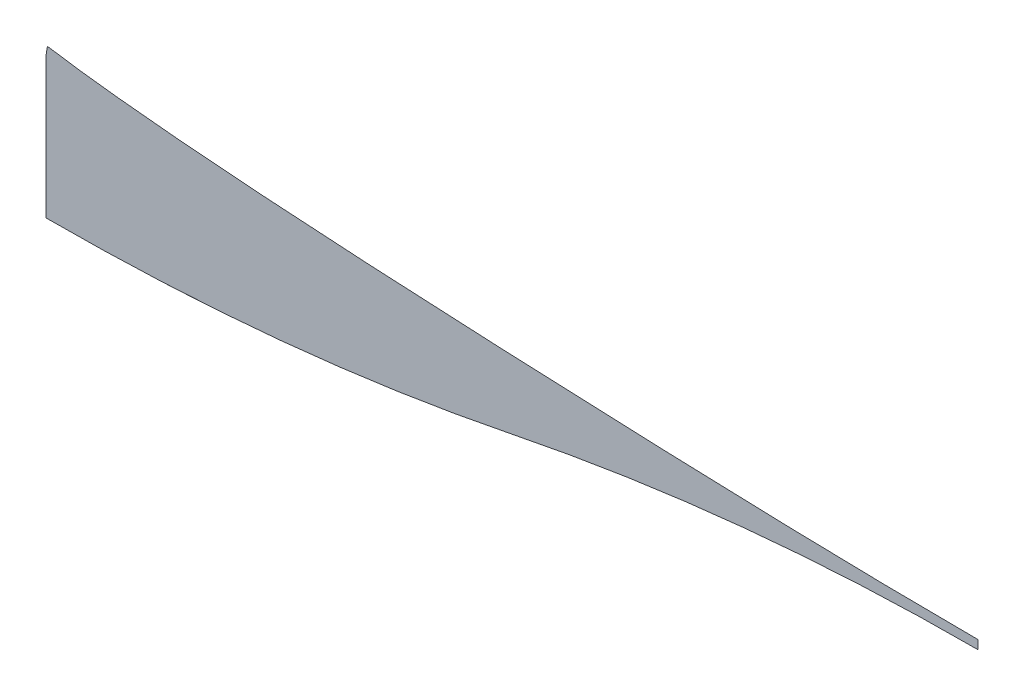
ISO-10303-21;
HEADER;
FILE_DESCRIPTION(('STEP AP214'),'2;1');
FILE_NAME('part.step','',(''),(''),'','','');
FILE_SCHEMA(('AUTOMOTIVE_DESIGN { 1 0 10303 214 1 1 1 1 }'));
ENDSEC;
DATA;
#1=APPLICATION_CONTEXT('core data for automotive mechanical design processes');
#2=APPLICATION_PROTOCOL_DEFINITION('international standard','automotive_design',2000,#1);
#3=PRODUCT_CONTEXT('',#1,'mechanical');
#4=PRODUCT('Part','Part','',(#3));
#5=PRODUCT_RELATED_PRODUCT_CATEGORY('part','',(#4));
#6=PRODUCT_DEFINITION_FORMATION('','',#4);
#7=PRODUCT_DEFINITION_CONTEXT('part definition',#1,'design');
#8=PRODUCT_DEFINITION('design','',#6,#7);
#9=PRODUCT_DEFINITION_SHAPE('','',#8);
#10=(LENGTH_UNIT() NAMED_UNIT(*) SI_UNIT(.MILLI.,.METRE.));
#11=(NAMED_UNIT(*) PLANE_ANGLE_UNIT() SI_UNIT($,.RADIAN.));
#12=(NAMED_UNIT(*) SI_UNIT($,.STERADIAN.) SOLID_ANGLE_UNIT());
#13=UNCERTAINTY_MEASURE_WITH_UNIT(LENGTH_MEASURE(1.E-05),#10,'distance_accuracy_value','');
#14=(GEOMETRIC_REPRESENTATION_CONTEXT(3) GLOBAL_UNCERTAINTY_ASSIGNED_CONTEXT((#13)) GLOBAL_UNIT_ASSIGNED_CONTEXT((#10,
#11,#12)) REPRESENTATION_CONTEXT('',''));
#15=CARTESIAN_POINT('',(0.,0.,0.));
#16=DIRECTION('',(0.,0.,1.));
#17=DIRECTION('',(1.,0.,0.));
#18=AXIS2_PLACEMENT_3D('',#15,#16,#17);
#19=CARTESIAN_POINT('',(127.717204100673,-6776.33498695925,0.0001778));
#20=DIRECTION('',(0.,0.,-1.));
#21=DIRECTION('',(-1.,0.,0.));
#22=AXIS2_PLACEMENT_3D('',#19,#20,#21);
#23=CYLINDRICAL_SURFACE('',#22,6625.43783079848);
#24=CARTESIAN_POINT('',(127.717204100673,-6776.33498695925,0.));
#25=DIRECTION('',(0.,0.,1.));
#26=DIRECTION('',(1.,0.,0.));
#27=AXIS2_PLACEMENT_3D('',#24,#25,#26);
#28=CIRCLE('',#27,6625.43783079848);
#29=CARTESIAN_POINT('',(137.956876276584,-150.905068916992,0.));
#30=VERTEX_POINT('',#29);
#31=CARTESIAN_POINT('',(-1187.04312372342,-282.658699203938,0.));
#32=VERTEX_POINT('',#31);
#33=EDGE_CURVE('E124',#30,#32,#28,.T.);
#34=ORIENTED_EDGE('',*,*,#33,.F.);
#35=DIRECTION('',(0.,0.,-1.));
#36=VECTOR('',#35,1.);
#37=CARTESIAN_POINT('',(137.956876276584,-150.905068916992,0.0001778));
#38=LINE('',#37,#36);
#39=CARTESIAN_POINT('',(137.956876276584,-150.905068916992,0.0001778));
#40=VERTEX_POINT('',#39);
#41=EDGE_CURVE('E11',#40,#30,#38,.T.);
#42=ORIENTED_EDGE('',*,*,#41,.F.);
#43=CARTESIAN_POINT('',(127.717204100673,-6776.33498695925,0.0001778));
#44=DIRECTION('',(0.,0.,1.));
#45=DIRECTION('',(1.,0.,0.));
#46=AXIS2_PLACEMENT_3D('',#43,#44,#45);
#47=CIRCLE('',#46,6625.43783079848);
#48=CARTESIAN_POINT('',(-1187.04312372342,-282.658699203938,0.0001778));
#49=VERTEX_POINT('',#48);
#50=EDGE_CURVE('E153',#40,#49,#47,.T.);
#51=ORIENTED_EDGE('',*,*,#50,.T.);
#52=DIRECTION('',(0.,0.,-1.));
#53=VECTOR('',#52,1.);
#54=CARTESIAN_POINT('',(-1187.04312372342,-282.658699203938,0.0001778));
#55=LINE('',#54,#53);
#56=EDGE_CURVE('E55',#49,#32,#55,.T.);
#57=ORIENTED_EDGE('',*,*,#56,.T.);
#58=EDGE_LOOP('',(#34,#42,#51,#57));
#59=FACE_BOUND('',#58,.T.);
#60=ADVANCED_FACE('F39',(#59),#23,.F.);
#61=CARTESIAN_POINT('',(137.956876276584,0.,0.0001778));
#62=DIRECTION('',(-1.,0.,0.));
#63=DIRECTION('',(0.,0.,1.));
#64=AXIS2_PLACEMENT_3D('',#61,#62,#63);
#65=PLANE('',#64);
#66=DIRECTION('',(0.,1.,0.));
#67=VECTOR('',#66,1.);
#68=CARTESIAN_POINT('',(137.956876276584,0.,0.));
#69=LINE('',#68,#67);
#70=CARTESIAN_POINT('',(137.956876276584,-125.905045826044,0.));
#71=VERTEX_POINT('',#70);
#72=EDGE_CURVE('E175',#30,#71,#69,.T.);
#73=ORIENTED_EDGE('',*,*,#72,.T.);
#74=DIRECTION('',(0.,0.,-1.));
#75=VECTOR('',#74,1.);
#76=CARTESIAN_POINT('',(137.956876276584,-125.905045826044,0.0001778));
#77=LINE('',#76,#75);
#78=CARTESIAN_POINT('',(137.956876276584,-125.905045826044,0.0001778));
#79=VERTEX_POINT('',#78);
#80=EDGE_CURVE('E47',#79,#71,#77,.T.);
#81=ORIENTED_EDGE('',*,*,#80,.F.);
#82=DIRECTION('',(0.,1.,0.));
#83=VECTOR('',#82,1.);
#84=CARTESIAN_POINT('',(137.956876276584,0.,0.0001778));
#85=LINE('',#84,#83);
#86=EDGE_CURVE('E148',#40,#79,#85,.T.);
#87=ORIENTED_EDGE('',*,*,#86,.F.);
#88=ORIENTED_EDGE('',*,*,#41,.T.);
#89=EDGE_LOOP('',(#73,#81,#87,#88));
#90=FACE_BOUND('',#89,.T.);
#91=ADVANCED_FACE('F142',(#90),#65,.F.);
#92=CARTESIAN_POINT('',(975.767433575463,-101.372984816679,0.0001778));
#93=CARTESIAN_POINT('',(933.957103022168,-104.13952428829,0.0001778));
#94=CARTESIAN_POINT('',(842.628938153737,-109.587155868705,0.0001778));
#95=CARTESIAN_POINT('',(704.535974161925,-116.026081010872,0.0001778));
#96=CARTESIAN_POINT('',(560.548566736365,-120.894649589598,0.0001778));
#97=CARTESIAN_POINT('',(418.370045646969,-124.06127493741,0.0001778));
#98=CARTESIAN_POINT('',(230.174228773502,-126.297397991888,0.0001778));
#99=CARTESIAN_POINT('',(-4.22221645529031,-125.804937151608,0.0001778));
#100=CARTESIAN_POINT('',(-241.571680644282,-121.779938851658,0.0001778));
#101=CARTESIAN_POINT('',(-435.623631421352,-116.795611582897,0.0001778));
#102=CARTESIAN_POINT('',(-583.894620309844,-112.243684307374,0.0001778));
#103=CARTESIAN_POINT('',(-735.605527532787,-106.939667032402,0.0001778));
#104=CARTESIAN_POINT('',(-865.564760999921,-101.937822413628,0.0001778));
#105=CARTESIAN_POINT('',(-958.768657741823,-98.1517669723793,0.0001778));
#106=CARTESIAN_POINT('',(-1012.77491874757,-95.9094875359348,0.0001778));
#107=CARTESIAN_POINT('',(-1094.32601011353,-92.4747415750547,0.0001778));
#108=CARTESIAN_POINT('',(-1217.95239066856,-87.0792352454186,0.0001778));
#109=CARTESIAN_POINT('',(-1383.80764615355,-79.293536673196,0.0001778));
#110=CARTESIAN_POINT('',(-1548.76075657378,-70.8533444940839,0.0001778));
#111=CARTESIAN_POINT('',(-1764.88706881012,-58.6426273535858,0.0001778));
#112=CARTESIAN_POINT('',(-1971.32289349782,-44.869434749297,0.0001778));
#113=CARTESIAN_POINT('',(-2254.31940597964,-21.4905008591299,0.0001778));
#114=CARTESIAN_POINT('',(-2413.84111278025,-3.32315689472454,0.0001778));
#115=CARTESIAN_POINT('',(-2508.02440172636,12.0161842509119,0.0001778));
#116=B_SPLINE_CURVE_WITH_KNOTS('',3,(#92,#93,#94,#95,#96,#97,#98,#99,#100,#101,#102,#103,#104,
#105,#106,#107,#108,#109,#110,#111,#112,#113,#114,#115),.UNSPECIFIED.,.F.,.F.,(4,1,1,1,1,1,1,1,
1,1,1,1,1,1,1,1,1,1,1,1,1,4),(0.00232177353394958,0.0280624912432003,0.0593124912432003,
0.0905624912432003,0.1218124912432,0.1530624912432,0.2155624912432,0.2780624912432,
0.3093124912432,0.3405624912432,0.3718124912432,0.4030624912432,0.4186874912432,0.4264999912432,
0.4343124912432,0.4655624912432,0.4968124912432,0.5280624912432,0.5593124912432,0.6218124912432,
0.6530624912432,0.7468124912432),.UNSPECIFIED.);
#117=DIRECTION('',(0.,0.,-1.));
#118=VECTOR('',#117,1.);
#119=SURFACE_OF_LINEAR_EXTRUSION('',#116,#118);
#120=CARTESIAN_POINT('',(975.767433575463,-101.372984816679,0.));
#121=CARTESIAN_POINT('',(933.957103022168,-104.13952428829,0.));
#122=CARTESIAN_POINT('',(842.628938153737,-109.587155868705,0.));
#123=CARTESIAN_POINT('',(704.535974161925,-116.026081010872,0.));
#124=CARTESIAN_POINT('',(560.548566736365,-120.894649589598,0.));
#125=CARTESIAN_POINT('',(418.370045646969,-124.06127493741,0.));
#126=CARTESIAN_POINT('',(230.174228773502,-126.297397991888,0.));
#127=CARTESIAN_POINT('',(-4.22221645529031,-125.804937151608,0.));
#128=CARTESIAN_POINT('',(-241.571680644282,-121.779938851658,0.));
#129=CARTESIAN_POINT('',(-435.623631421352,-116.795611582897,0.));
#130=CARTESIAN_POINT('',(-583.894620309844,-112.243684307374,0.));
#131=CARTESIAN_POINT('',(-735.605527532787,-106.939667032402,0.));
#132=CARTESIAN_POINT('',(-865.564760999921,-101.937822413628,0.));
#133=CARTESIAN_POINT('',(-958.768657741823,-98.1517669723793,0.));
#134=CARTESIAN_POINT('',(-1012.77491874757,-95.9094875359348,0.));
#135=CARTESIAN_POINT('',(-1094.32601011353,-92.4747415750547,0.));
#136=CARTESIAN_POINT('',(-1217.95239066856,-87.0792352454186,0.));
#137=CARTESIAN_POINT('',(-1383.80764615355,-79.293536673196,0.));
#138=CARTESIAN_POINT('',(-1548.76075657378,-70.8533444940839,0.));
#139=CARTESIAN_POINT('',(-1764.88706881012,-58.6426273535858,0.));
#140=CARTESIAN_POINT('',(-1971.32289349782,-44.869434749297,0.));
#141=CARTESIAN_POINT('',(-2254.31940597964,-21.4905008591299,0.));
#142=CARTESIAN_POINT('',(-2413.84111278025,-3.32315689472454,0.));
#143=CARTESIAN_POINT('',(-2508.02440172636,12.0161842509119,0.));
#144=B_SPLINE_CURVE_WITH_KNOTS('',3,(#120,#121,#122,#123,#124,#125,#126,#127,#128,#129,#130,
#131,#132,#133,#134,#135,#136,#137,#138,#139,#140,#141,#142,#143),.UNSPECIFIED.,.F.,.F.,(4,1,1,
1,1,1,1,1,1,1,1,1,1,1,1,1,1,1,1,1,1,4),(0.00232177353394958,0.0280624912432003,
0.0593124912432003,0.0905624912432003,0.1218124912432,0.1530624912432,0.2155624912432,
0.2780624912432,0.3093124912432,0.3405624912432,0.3718124912432,0.4030624912432,0.4186874912432,
0.4264999912432,0.4343124912432,0.4655624912432,0.4968124912432,0.5280624912432,0.5593124912432,
0.6218124912432,0.6530624912432,0.7468124912432),.UNSPECIFIED.);
#145=CARTESIAN_POINT('',(-2508.02440172636,12.016184250912,0.));
#146=VERTEX_POINT('',#145);
#147=EDGE_CURVE('E172',#71,#146,#144,.T.);
#148=ORIENTED_EDGE('',*,*,#147,.T.);
#149=DIRECTION('',(0.,0.,-1.));
#150=VECTOR('',#149,1.);
#151=CARTESIAN_POINT('',(-2508.02440172636,12.016184250912,0.0001778));
#152=LINE('',#151,#150);
#153=CARTESIAN_POINT('',(-2508.02440172636,12.016184250912,0.0001778));
#154=VERTEX_POINT('',#153);
#155=EDGE_CURVE('E113',#154,#146,#152,.T.);
#156=ORIENTED_EDGE('',*,*,#155,.F.);
#157=EDGE_CURVE('E101',#79,#154,#116,.T.);
#158=ORIENTED_EDGE('',*,*,#157,.F.);
#159=ORIENTED_EDGE('',*,*,#80,.T.);
#160=EDGE_LOOP('',(#148,#156,#158,#159));
#161=FACE_BOUND('',#160,.T.);
#162=ADVANCED_FACE('F140',(#161),#119,.F.);
#163=CARTESIAN_POINT('',(-2445.12301211132,398.229626991284,0.0001778));
#164=DIRECTION('',(0.986995338193962,-0.160748879882213,0.));
#165=DIRECTION('',(0.160748879882213,0.986995338193962,0.));
#166=AXIS2_PLACEMENT_3D('',#163,#164,#165);
#167=PLANE('',#166);
#168=DIRECTION('',(-0.160748879882213,-0.986995338193962,0.));
#169=VECTOR('',#168,1.);
#170=CARTESIAN_POINT('',(-2445.12301211132,398.229626991284,0.));
#171=LINE('',#170,#169);
#172=CARTESIAN_POINT('',(-2512.04312372342,-12.6586992039371,0.));
#173=VERTEX_POINT('',#172);
#174=EDGE_CURVE('E110',#146,#173,#171,.T.);
#175=ORIENTED_EDGE('',*,*,#174,.T.);
#176=DIRECTION('',(0.,0.,-1.));
#177=VECTOR('',#176,1.);
#178=CARTESIAN_POINT('',(-2512.04312372342,-12.6586992039371,0.0001778));
#179=LINE('',#178,#177);
#180=CARTESIAN_POINT('',(-2512.04312372342,-12.6586992039371,0.0001778));
#181=VERTEX_POINT('',#180);
#182=EDGE_CURVE('E107',#181,#173,#179,.T.);
#183=ORIENTED_EDGE('',*,*,#182,.F.);
#184=DIRECTION('',(-0.160748879882213,-0.986995338193962,0.));
#185=VECTOR('',#184,1.);
#186=CARTESIAN_POINT('',(-2445.12301211132,398.229626991284,0.0001778));
#187=LINE('',#186,#185);
#188=EDGE_CURVE('E93',#154,#181,#187,.T.);
#189=ORIENTED_EDGE('',*,*,#188,.F.);
#190=ORIENTED_EDGE('',*,*,#155,.T.);
#191=EDGE_LOOP('',(#175,#183,#189,#190));
#192=FACE_BOUND('',#191,.T.);
#193=ADVANCED_FACE('F108',(#192),#167,.F.);
#194=CARTESIAN_POINT('',(-2512.04312372342,0.,0.0001778));
#195=DIRECTION('',(1.,0.,0.));
#196=DIRECTION('',(0.,0.,-1.));
#197=AXIS2_PLACEMENT_3D('',#194,#195,#196);
#198=PLANE('',#197);
#199=DIRECTION('',(0.,-1.,0.));
#200=VECTOR('',#199,1.);
#201=CARTESIAN_POINT('',(-2512.04312372342,0.,0.));
#202=LINE('',#201,#200);
#203=CARTESIAN_POINT('',(-2512.04312372342,-412.658699203937,0.));
#204=VERTEX_POINT('',#203);
#205=EDGE_CURVE('E156',#173,#204,#202,.T.);
#206=ORIENTED_EDGE('',*,*,#205,.T.);
#207=DIRECTION('',(0.,0.,-1.));
#208=VECTOR('',#207,1.);
#209=CARTESIAN_POINT('',(-2512.04312372342,-412.658699203937,0.0001778));
#210=LINE('',#209,#208);
#211=CARTESIAN_POINT('',(-2512.04312372342,-412.658699203937,0.0001778));
#212=VERTEX_POINT('',#211);
#213=EDGE_CURVE('E75',#212,#204,#210,.T.);
#214=ORIENTED_EDGE('',*,*,#213,.F.);
#215=DIRECTION('',(0.,-1.,0.));
#216=VECTOR('',#215,1.);
#217=CARTESIAN_POINT('',(-2512.04312372342,0.,0.0001778));
#218=LINE('',#217,#216);
#219=EDGE_CURVE('E99',#181,#212,#218,.T.);
#220=ORIENTED_EDGE('',*,*,#219,.F.);
#221=ORIENTED_EDGE('',*,*,#182,.T.);
#222=EDGE_LOOP('',(#206,#214,#220,#221));
#223=FACE_BOUND('',#222,.T.);
#224=ADVANCED_FACE('F115',(#223),#198,.F.);
#225=CARTESIAN_POINT('',(-1187.04312372342,-282.658699203937,0.0001778));
#226=CARTESIAN_POINT('',(-1624.82987950431,-371.296418893302,0.0001778));
#227=CARTESIAN_POINT('',(-2064.01860193134,-412.658699203937,0.0001778));
#228=CARTESIAN_POINT('',(-2512.04312372342,-412.658699203937,0.0001778));
#229=B_SPLINE_CURVE_WITH_KNOTS('',3,(#225,#226,#227,#228),.UNSPECIFIED.,.F.,.F.,(4,4),(0.,1.),.UNSPECIFIED.);
#230=DIRECTION('',(0.,0.,-1.));
#231=VECTOR('',#230,1.);
#232=SURFACE_OF_LINEAR_EXTRUSION('',#229,#231);
#233=CARTESIAN_POINT('',(-1187.04312372342,-282.658699203937,0.));
#234=CARTESIAN_POINT('',(-1624.82987950431,-371.296418893302,0.));
#235=CARTESIAN_POINT('',(-2064.01860193134,-412.658699203937,0.));
#236=CARTESIAN_POINT('',(-2512.04312372342,-412.658699203937,0.));
#237=B_SPLINE_CURVE_WITH_KNOTS('',3,(#233,#234,#235,#236),.UNSPECIFIED.,.F.,.F.,(4,4),(0.,1.),.UNSPECIFIED.);
#238=EDGE_CURVE('E154',#32,#204,#237,.T.);
#239=ORIENTED_EDGE('',*,*,#238,.F.);
#240=ORIENTED_EDGE('',*,*,#56,.F.);
#241=EDGE_CURVE('E116',#49,#212,#229,.T.);
#242=ORIENTED_EDGE('',*,*,#241,.T.);
#243=ORIENTED_EDGE('',*,*,#213,.T.);
#244=EDGE_LOOP('',(#239,#240,#242,#243));
#245=FACE_BOUND('',#244,.T.);
#246=ADVANCED_FACE('F130',(#245),#232,.T.);
#247=CARTESIAN_POINT('',(0.,0.,0.0001778));
#248=DIRECTION('',(0.,0.,1.));
#249=DIRECTION('',(1.,0.,0.));
#250=AXIS2_PLACEMENT_3D('',#247,#248,#249);
#251=PLANE('',#250);
#252=ORIENTED_EDGE('',*,*,#50,.F.);
#253=ORIENTED_EDGE('',*,*,#86,.T.);
#254=ORIENTED_EDGE('',*,*,#157,.T.);
#255=ORIENTED_EDGE('',*,*,#188,.T.);
#256=ORIENTED_EDGE('',*,*,#219,.T.);
#257=ORIENTED_EDGE('',*,*,#241,.F.);
#258=EDGE_LOOP('',(#252,#253,#254,#255,#256,#257));
#259=FACE_BOUND('',#258,.T.);
#260=ADVANCED_FACE('F96',(#259),#251,.T.);
#261=CARTESIAN_POINT('',(0.,0.,0.));
#262=DIRECTION('',(0.,0.,1.));
#263=DIRECTION('',(1.,0.,0.));
#264=AXIS2_PLACEMENT_3D('',#261,#262,#263);
#265=PLANE('',#264);
#266=ORIENTED_EDGE('',*,*,#33,.T.);
#267=ORIENTED_EDGE('',*,*,#238,.T.);
#268=ORIENTED_EDGE('',*,*,#205,.F.);
#269=ORIENTED_EDGE('',*,*,#174,.F.);
#270=ORIENTED_EDGE('',*,*,#147,.F.);
#271=ORIENTED_EDGE('',*,*,#72,.F.);
#272=EDGE_LOOP('',(#266,#267,#268,#269,#270,#271));
#273=FACE_BOUND('',#272,.T.);
#274=ADVANCED_FACE('F134',(#273),#265,.F.);
#275=CLOSED_SHELL('',(#60,#91,#162,#193,#224,#246,#260,#274));
#276=MANIFOLD_SOLID_BREP('B2',#275);
#277=ADVANCED_BREP_SHAPE_REPRESENTATION('',(#18,#276),#14);
#278=SHAPE_DEFINITION_REPRESENTATION(#9,#277);
ENDSEC;
END-ISO-10303-21;
